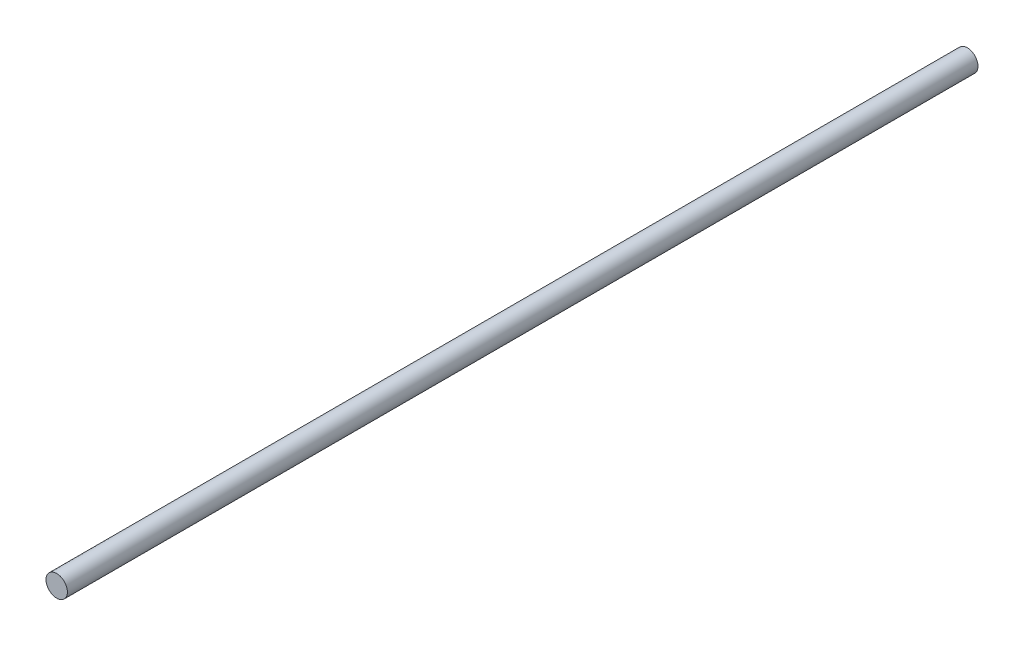
ISO-10303-21;
HEADER;
FILE_DESCRIPTION(('STEP AP214'),'2;1');
FILE_NAME('part.step','',(''),(''),'','','');
FILE_SCHEMA(('AUTOMOTIVE_DESIGN { 1 0 10303 214 1 1 1 1 }'));
ENDSEC;
DATA;
#1=APPLICATION_CONTEXT('core data for automotive mechanical design processes');
#2=APPLICATION_PROTOCOL_DEFINITION('international standard','automotive_design',2000,#1);
#3=PRODUCT_CONTEXT('',#1,'mechanical');
#4=PRODUCT('Part','Part','',(#3));
#5=PRODUCT_RELATED_PRODUCT_CATEGORY('part','',(#4));
#6=PRODUCT_DEFINITION_FORMATION('','',#4);
#7=PRODUCT_DEFINITION_CONTEXT('part definition',#1,'design');
#8=PRODUCT_DEFINITION('design','',#6,#7);
#9=PRODUCT_DEFINITION_SHAPE('','',#8);
#10=(LENGTH_UNIT() NAMED_UNIT(*) SI_UNIT(.MILLI.,.METRE.));
#11=(NAMED_UNIT(*) PLANE_ANGLE_UNIT() SI_UNIT($,.RADIAN.));
#12=(NAMED_UNIT(*) SI_UNIT($,.STERADIAN.) SOLID_ANGLE_UNIT());
#13=UNCERTAINTY_MEASURE_WITH_UNIT(LENGTH_MEASURE(1.E-05),#10,'distance_accuracy_value','');
#14=(GEOMETRIC_REPRESENTATION_CONTEXT(3) GLOBAL_UNCERTAINTY_ASSIGNED_CONTEXT((#13)) GLOBAL_UNIT_ASSIGNED_CONTEXT((#10,
#11,#12)) REPRESENTATION_CONTEXT('',''));
#15=CARTESIAN_POINT('',(0.,0.,0.));
#16=DIRECTION('',(0.,0.,1.));
#17=DIRECTION('',(1.,0.,0.));
#18=AXIS2_PLACEMENT_3D('',#15,#16,#17);
#19=CARTESIAN_POINT('',(0.,0.,85.));
#20=DIRECTION('',(0.,0.,-1.));
#21=DIRECTION('',(-1.,0.,0.));
#22=AXIS2_PLACEMENT_3D('',#19,#20,#21);
#23=CYLINDRICAL_SURFACE('',#22,2.);
#24=CARTESIAN_POINT('',(0.,0.,85.));
#25=DIRECTION('',(0.,0.,1.));
#26=DIRECTION('',(1.,0.,0.));
#27=AXIS2_PLACEMENT_3D('',#24,#25,#26);
#28=CIRCLE('',#27,2.);
#29=CARTESIAN_POINT('',(2.,0.,85.));
#30=VERTEX_POINT('',#29);
#31=EDGE_CURVE('E10',#30,#30,#28,.T.);
#32=ORIENTED_EDGE('',*,*,#31,.F.);
#33=EDGE_LOOP('',(#32));
#34=FACE_BOUND('',#33,.T.);
#35=CARTESIAN_POINT('',(0.,0.,-85.));
#36=DIRECTION('',(0.,0.,1.));
#37=DIRECTION('',(1.,0.,0.));
#38=AXIS2_PLACEMENT_3D('',#35,#36,#37);
#39=CIRCLE('',#38,2.);
#40=CARTESIAN_POINT('',(2.,0.,-85.));
#41=VERTEX_POINT('',#40);
#42=EDGE_CURVE('E33',#41,#41,#39,.T.);
#43=ORIENTED_EDGE('',*,*,#42,.T.);
#44=EDGE_LOOP('',(#43));
#45=FACE_BOUND('',#44,.T.);
#46=ADVANCED_FACE('F30',(#34,#45),#23,.T.);
#47=CARTESIAN_POINT('',(0.,0.,85.));
#48=DIRECTION('',(0.,0.,1.));
#49=DIRECTION('',(1.,0.,0.));
#50=AXIS2_PLACEMENT_3D('',#47,#48,#49);
#51=PLANE('',#50);
#52=ORIENTED_EDGE('',*,*,#31,.T.);
#53=EDGE_LOOP('',(#52));
#54=FACE_BOUND('',#53,.T.);
#55=ADVANCED_FACE('F45',(#54),#51,.T.);
#56=CARTESIAN_POINT('',(0.,0.,-85.));
#57=DIRECTION('',(0.,0.,1.));
#58=DIRECTION('',(1.,0.,0.));
#59=AXIS2_PLACEMENT_3D('',#56,#57,#58);
#60=PLANE('',#59);
#61=ORIENTED_EDGE('',*,*,#42,.F.);
#62=EDGE_LOOP('',(#61));
#63=FACE_BOUND('',#62,.T.);
#64=ADVANCED_FACE('F43',(#63),#60,.F.);
#65=CLOSED_SHELL('',(#46,#55,#64));
#66=MANIFOLD_SOLID_BREP('B2',#65);
#67=ADVANCED_BREP_SHAPE_REPRESENTATION('',(#18,#66),#14);
#68=SHAPE_DEFINITION_REPRESENTATION(#9,#67);
ENDSEC;
END-ISO-10303-21;
